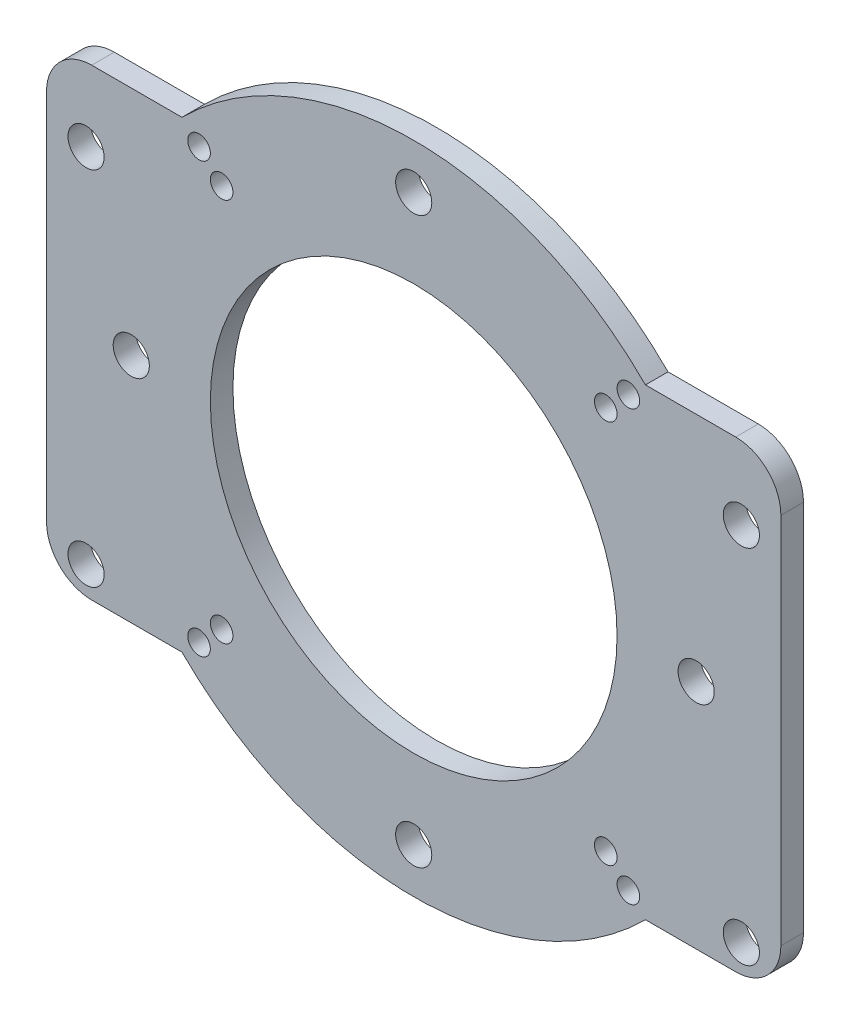
ISO-10303-21;
HEADER;
FILE_DESCRIPTION(('STEP AP214'),'2;1');
FILE_NAME('part.step','',(''),(''),'','','');
FILE_SCHEMA(('AUTOMOTIVE_DESIGN { 1 0 10303 214 1 1 1 1 }'));
ENDSEC;
DATA;
#1=APPLICATION_CONTEXT('core data for automotive mechanical design processes');
#2=APPLICATION_PROTOCOL_DEFINITION('international standard','automotive_design',2000,#1);
#3=PRODUCT_CONTEXT('',#1,'mechanical');
#4=PRODUCT('Part','Part','',(#3));
#5=PRODUCT_RELATED_PRODUCT_CATEGORY('part','',(#4));
#6=PRODUCT_DEFINITION_FORMATION('','',#4);
#7=PRODUCT_DEFINITION_CONTEXT('part definition',#1,'design');
#8=PRODUCT_DEFINITION('design','',#6,#7);
#9=PRODUCT_DEFINITION_SHAPE('','',#8);
#10=(LENGTH_UNIT() NAMED_UNIT(*) SI_UNIT(.MILLI.,.METRE.));
#11=(NAMED_UNIT(*) PLANE_ANGLE_UNIT() SI_UNIT($,.RADIAN.));
#12=(NAMED_UNIT(*) SI_UNIT($,.STERADIAN.) SOLID_ANGLE_UNIT());
#13=UNCERTAINTY_MEASURE_WITH_UNIT(LENGTH_MEASURE(1.E-05),#10,'distance_accuracy_value','');
#14=(GEOMETRIC_REPRESENTATION_CONTEXT(3) GLOBAL_UNCERTAINTY_ASSIGNED_CONTEXT((#13)) GLOBAL_UNIT_ASSIGNED_CONTEXT((#10,
#11,#12)) REPRESENTATION_CONTEXT('',''));
#15=CARTESIAN_POINT('',(0.,0.,0.));
#16=DIRECTION('',(0.,0.,1.));
#17=DIRECTION('',(1.,0.,0.));
#18=AXIS2_PLACEMENT_3D('',#15,#16,#17);
#19=CARTESIAN_POINT('',(0.,0.,2.));
#20=DIRECTION('',(0.,0.,1.));
#21=DIRECTION('',(1.,0.,0.));
#22=AXIS2_PLACEMENT_3D('',#19,#20,#21);
#23=PLANE('',#22);
#24=CARTESIAN_POINT('',(0.,25.,2.));
#25=DIRECTION('',(0.,0.,1.));
#26=DIRECTION('',(1.,0.,0.));
#27=AXIS2_PLACEMENT_3D('',#24,#25,#26);
#28=CIRCLE('',#27,1.6);
#29=CARTESIAN_POINT('',(1.6,25.,2.));
#30=VERTEX_POINT('',#29);
#31=EDGE_CURVE('E621',#30,#30,#28,.T.);
#32=ORIENTED_EDGE('',*,*,#31,.F.);
#33=EDGE_LOOP('',(#32));
#34=FACE_BOUND('',#33,.T.);
#35=CARTESIAN_POINT('',(-25.,0.,2.));
#36=DIRECTION('',(0.,0.,1.));
#37=DIRECTION('',(1.,0.,0.));
#38=AXIS2_PLACEMENT_3D('',#35,#36,#37);
#39=CIRCLE('',#38,1.6);
#40=CARTESIAN_POINT('',(-23.4,0.,2.));
#41=VERTEX_POINT('',#40);
#42=EDGE_CURVE('E637',#41,#41,#39,.T.);
#43=ORIENTED_EDGE('',*,*,#42,.F.);
#44=EDGE_LOOP('',(#43));
#45=FACE_BOUND('',#44,.T.);
#46=CARTESIAN_POINT('',(25.,0.,2.));
#47=DIRECTION('',(0.,0.,1.));
#48=DIRECTION('',(1.,0.,0.));
#49=AXIS2_PLACEMENT_3D('',#46,#47,#48);
#50=CIRCLE('',#49,1.6);
#51=CARTESIAN_POINT('',(26.6,0.,2.));
#52=VERTEX_POINT('',#51);
#53=EDGE_CURVE('E631',#52,#52,#50,.T.);
#54=ORIENTED_EDGE('',*,*,#53,.F.);
#55=EDGE_LOOP('',(#54));
#56=FACE_BOUND('',#55,.T.);
#57=CARTESIAN_POINT('',(0.,-25.,2.));
#58=DIRECTION('',(0.,0.,1.));
#59=DIRECTION('',(1.,0.,0.));
#60=AXIS2_PLACEMENT_3D('',#57,#58,#59);
#61=CIRCLE('',#60,1.6);
#62=CARTESIAN_POINT('',(1.6,-25.,2.));
#63=VERTEX_POINT('',#62);
#64=EDGE_CURVE('E625',#63,#63,#61,.T.);
#65=ORIENTED_EDGE('',*,*,#64,.F.);
#66=EDGE_LOOP('',(#65));
#67=FACE_BOUND('',#66,.T.);
#68=CARTESIAN_POINT('',(-19.,19.,2.));
#69=DIRECTION('',(0.,0.,1.));
#70=DIRECTION('',(1.,0.,0.));
#71=AXIS2_PLACEMENT_3D('',#68,#69,#70);
#72=CIRCLE('',#71,0.999999999999987);
#73=CARTESIAN_POINT('',(-18.,19.,2.));
#74=VERTEX_POINT('',#73);
#75=EDGE_CURVE('E618',#74,#74,#72,.T.);
#76=ORIENTED_EDGE('',*,*,#75,.F.);
#77=EDGE_LOOP('',(#76));
#78=FACE_BOUND('',#77,.T.);
#79=CARTESIAN_POINT('',(-17.,17.,2.));
#80=DIRECTION('',(0.,0.,1.));
#81=DIRECTION('',(1.,0.,0.));
#82=AXIS2_PLACEMENT_3D('',#79,#80,#81);
#83=CIRCLE('',#82,0.999999999999987);
#84=CARTESIAN_POINT('',(-16.,17.,2.));
#85=VERTEX_POINT('',#84);
#86=EDGE_CURVE('E612',#85,#85,#83,.T.);
#87=ORIENTED_EDGE('',*,*,#86,.F.);
#88=EDGE_LOOP('',(#87));
#89=FACE_BOUND('',#88,.T.);
#90=CARTESIAN_POINT('',(17.,17.,2.));
#91=DIRECTION('',(0.,0.,1.));
#92=DIRECTION('',(1.,0.,0.));
#93=AXIS2_PLACEMENT_3D('',#90,#91,#92);
#94=CIRCLE('',#93,0.999999999999987);
#95=CARTESIAN_POINT('',(18.,17.,2.));
#96=VERTEX_POINT('',#95);
#97=EDGE_CURVE('E606',#96,#96,#94,.T.);
#98=ORIENTED_EDGE('',*,*,#97,.F.);
#99=EDGE_LOOP('',(#98));
#100=FACE_BOUND('',#99,.T.);
#101=CARTESIAN_POINT('',(19.,19.,2.));
#102=DIRECTION('',(0.,0.,1.));
#103=DIRECTION('',(1.,0.,0.));
#104=AXIS2_PLACEMENT_3D('',#101,#102,#103);
#105=CIRCLE('',#104,0.999999999999987);
#106=CARTESIAN_POINT('',(20.,19.,2.));
#107=VERTEX_POINT('',#106);
#108=EDGE_CURVE('E600',#107,#107,#105,.T.);
#109=ORIENTED_EDGE('',*,*,#108,.F.);
#110=EDGE_LOOP('',(#109));
#111=FACE_BOUND('',#110,.T.);
#112=CARTESIAN_POINT('',(17.,-17.,2.));
#113=DIRECTION('',(0.,0.,1.));
#114=DIRECTION('',(1.,0.,0.));
#115=AXIS2_PLACEMENT_3D('',#112,#113,#114);
#116=CIRCLE('',#115,0.999999999999987);
#117=CARTESIAN_POINT('',(18.,-17.,2.));
#118=VERTEX_POINT('',#117);
#119=EDGE_CURVE('E594',#118,#118,#116,.T.);
#120=ORIENTED_EDGE('',*,*,#119,.F.);
#121=EDGE_LOOP('',(#120));
#122=FACE_BOUND('',#121,.T.);
#123=CARTESIAN_POINT('',(19.,-19.,2.));
#124=DIRECTION('',(0.,0.,1.));
#125=DIRECTION('',(1.,0.,0.));
#126=AXIS2_PLACEMENT_3D('',#123,#124,#125);
#127=CIRCLE('',#126,0.999999999999987);
#128=CARTESIAN_POINT('',(20.,-19.,2.));
#129=VERTEX_POINT('',#128);
#130=EDGE_CURVE('E588',#129,#129,#127,.T.);
#131=ORIENTED_EDGE('',*,*,#130,.F.);
#132=EDGE_LOOP('',(#131));
#133=FACE_BOUND('',#132,.T.);
#134=CARTESIAN_POINT('',(-19.,-19.,2.));
#135=DIRECTION('',(0.,0.,1.));
#136=DIRECTION('',(1.,0.,0.));
#137=AXIS2_PLACEMENT_3D('',#134,#135,#136);
#138=CIRCLE('',#137,0.999999999999987);
#139=CARTESIAN_POINT('',(-18.,-19.,2.));
#140=VERTEX_POINT('',#139);
#141=EDGE_CURVE('E582',#140,#140,#138,.T.);
#142=ORIENTED_EDGE('',*,*,#141,.F.);
#143=EDGE_LOOP('',(#142));
#144=FACE_BOUND('',#143,.T.);
#145=CARTESIAN_POINT('',(-17.,-17.,2.));
#146=DIRECTION('',(0.,0.,1.));
#147=DIRECTION('',(1.,0.,0.));
#148=AXIS2_PLACEMENT_3D('',#145,#146,#147);
#149=CIRCLE('',#148,0.999999999999987);
#150=CARTESIAN_POINT('',(-16.,-17.,2.));
#151=VERTEX_POINT('',#150);
#152=EDGE_CURVE('E576',#151,#151,#149,.T.);
#153=ORIENTED_EDGE('',*,*,#152,.F.);
#154=EDGE_LOOP('',(#153));
#155=FACE_BOUND('',#154,.T.);
#156=CARTESIAN_POINT('',(29.,14.,2.));
#157=DIRECTION('',(0.,0.,1.));
#158=DIRECTION('',(1.,0.,0.));
#159=AXIS2_PLACEMENT_3D('',#156,#157,#158);
#160=CIRCLE('',#159,1.6);
#161=CARTESIAN_POINT('',(30.6,14.,2.));
#162=VERTEX_POINT('',#161);
#163=EDGE_CURVE('E556',#162,#162,#160,.T.);
#164=ORIENTED_EDGE('',*,*,#163,.F.);
#165=EDGE_LOOP('',(#164));
#166=FACE_BOUND('',#165,.T.);
#167=CARTESIAN_POINT('',(29.,-18.,2.));
#168=DIRECTION('',(0.,0.,1.));
#169=DIRECTION('',(1.,0.,0.));
#170=AXIS2_PLACEMENT_3D('',#167,#168,#169);
#171=CIRCLE('',#170,1.6);
#172=CARTESIAN_POINT('',(30.6,-18.,2.));
#173=VERTEX_POINT('',#172);
#174=EDGE_CURVE('E563',#173,#173,#171,.T.);
#175=ORIENTED_EDGE('',*,*,#174,.F.);
#176=EDGE_LOOP('',(#175));
#177=FACE_BOUND('',#176,.T.);
#178=CARTESIAN_POINT('',(-29.,-18.,2.));
#179=DIRECTION('',(0.,0.,1.));
#180=DIRECTION('',(1.,0.,0.));
#181=AXIS2_PLACEMENT_3D('',#178,#179,#180);
#182=CIRCLE('',#181,1.6);
#183=CARTESIAN_POINT('',(-27.4,-18.,2.));
#184=VERTEX_POINT('',#183);
#185=EDGE_CURVE('E569',#184,#184,#182,.T.);
#186=ORIENTED_EDGE('',*,*,#185,.F.);
#187=EDGE_LOOP('',(#186));
#188=FACE_BOUND('',#187,.T.);
#189=CARTESIAN_POINT('',(-29.,14.,2.));
#190=DIRECTION('',(0.,0.,1.));
#191=DIRECTION('',(1.,0.,0.));
#192=AXIS2_PLACEMENT_3D('',#189,#190,#191);
#193=CIRCLE('',#192,1.6);
#194=CARTESIAN_POINT('',(-27.4,14.,2.));
#195=VERTEX_POINT('',#194);
#196=EDGE_CURVE('E549',#195,#195,#193,.T.);
#197=ORIENTED_EDGE('',*,*,#196,.F.);
#198=EDGE_LOOP('',(#197));
#199=FACE_BOUND('',#198,.T.);
#200=DIRECTION('',(0.,-1.,0.));
#201=VECTOR('',#200,1.);
#202=CARTESIAN_POINT('',(-32.5,-20.5,2.));
#203=LINE('',#202,#201);
#204=CARTESIAN_POINT('',(-32.5,16.5,2.));
#205=VERTEX_POINT('',#204);
#206=CARTESIAN_POINT('',(-32.5,-16.5,2.));
#207=VERTEX_POINT('',#206);
#208=EDGE_CURVE('E240',#205,#207,#203,.T.);
#209=ORIENTED_EDGE('',*,*,#208,.T.);
#210=CARTESIAN_POINT('',(-28.5,-16.5,2.));
#211=DIRECTION('',(0.,0.,1.));
#212=DIRECTION('',(1.,0.,0.));
#213=AXIS2_PLACEMENT_3D('',#210,#211,#212);
#214=CIRCLE('',#213,4.);
#215=CARTESIAN_POINT('',(-28.5,-20.5,2.));
#216=VERTEX_POINT('',#215);
#217=EDGE_CURVE('E179',#207,#216,#214,.T.);
#218=ORIENTED_EDGE('',*,*,#217,.T.);
#219=DIRECTION('',(1.,0.,0.));
#220=VECTOR('',#219,1.);
#221=CARTESIAN_POINT('',(-20.512191496766,-20.5,2.));
#222=LINE('',#221,#220);
#223=CARTESIAN_POINT('',(-20.512191496766,-20.5,2.));
#224=VERTEX_POINT('',#223);
#225=EDGE_CURVE('E142',#216,#224,#222,.T.);
#226=ORIENTED_EDGE('',*,*,#225,.T.);
#227=CARTESIAN_POINT('',(0.,0.,2.));
#228=DIRECTION('',(0.,0.,1.));
#229=DIRECTION('',(1.,0.,0.));
#230=AXIS2_PLACEMENT_3D('',#227,#228,#229);
#231=CIRCLE('',#230,29.);
#232=CARTESIAN_POINT('',(20.512191496766,-20.5,2.));
#233=VERTEX_POINT('',#232);
#234=EDGE_CURVE('E136',#224,#233,#231,.T.);
#235=ORIENTED_EDGE('',*,*,#234,.T.);
#236=DIRECTION('',(1.,0.,0.));
#237=VECTOR('',#236,1.);
#238=CARTESIAN_POINT('',(32.5,-20.5,2.));
#239=LINE('',#238,#237);
#240=CARTESIAN_POINT('',(28.5,-20.5,2.));
#241=VERTEX_POINT('',#240);
#242=EDGE_CURVE('E126',#233,#241,#239,.T.);
#243=ORIENTED_EDGE('',*,*,#242,.T.);
#244=CARTESIAN_POINT('',(28.5,-16.5,2.));
#245=DIRECTION('',(0.,0.,1.));
#246=DIRECTION('',(1.,0.,0.));
#247=AXIS2_PLACEMENT_3D('',#244,#245,#246);
#248=CIRCLE('',#247,4.);
#249=CARTESIAN_POINT('',(32.5,-16.5,2.));
#250=VERTEX_POINT('',#249);
#251=EDGE_CURVE('E174',#241,#250,#248,.T.);
#252=ORIENTED_EDGE('',*,*,#251,.T.);
#253=DIRECTION('',(0.,1.,0.));
#254=VECTOR('',#253,1.);
#255=CARTESIAN_POINT('',(32.5,20.5,2.));
#256=LINE('',#255,#254);
#257=CARTESIAN_POINT('',(32.5,16.5,2.));
#258=VERTEX_POINT('',#257);
#259=EDGE_CURVE('E135',#250,#258,#256,.T.);
#260=ORIENTED_EDGE('',*,*,#259,.T.);
#261=CARTESIAN_POINT('',(28.5,16.5,2.));
#262=DIRECTION('',(0.,0.,1.));
#263=DIRECTION('',(1.,0.,0.));
#264=AXIS2_PLACEMENT_3D('',#261,#262,#263);
#265=CIRCLE('',#264,4.);
#266=CARTESIAN_POINT('',(28.5,20.5,2.));
#267=VERTEX_POINT('',#266);
#268=EDGE_CURVE('E58',#258,#267,#265,.T.);
#269=ORIENTED_EDGE('',*,*,#268,.T.);
#270=DIRECTION('',(-1.,0.,0.));
#271=VECTOR('',#270,1.);
#272=CARTESIAN_POINT('',(20.512191496766,20.5,2.));
#273=LINE('',#272,#271);
#274=CARTESIAN_POINT('',(20.512191496766,20.5,2.));
#275=VERTEX_POINT('',#274);
#276=EDGE_CURVE('E196',#267,#275,#273,.T.);
#277=ORIENTED_EDGE('',*,*,#276,.T.);
#278=CARTESIAN_POINT('',(0.,0.,2.));
#279=DIRECTION('',(0.,0.,1.));
#280=DIRECTION('',(1.,0.,0.));
#281=AXIS2_PLACEMENT_3D('',#278,#279,#280);
#282=CIRCLE('',#281,29.);
#283=CARTESIAN_POINT('',(-20.512191496766,20.5,2.));
#284=VERTEX_POINT('',#283);
#285=EDGE_CURVE('E244',#275,#284,#282,.T.);
#286=ORIENTED_EDGE('',*,*,#285,.T.);
#287=DIRECTION('',(-1.,0.,0.));
#288=VECTOR('',#287,1.);
#289=CARTESIAN_POINT('',(-32.5,20.5,2.));
#290=LINE('',#289,#288);
#291=CARTESIAN_POINT('',(-28.5,20.5,2.));
#292=VERTEX_POINT('',#291);
#293=EDGE_CURVE('E228',#284,#292,#290,.T.);
#294=ORIENTED_EDGE('',*,*,#293,.T.);
#295=CARTESIAN_POINT('',(-28.5,16.5,2.));
#296=DIRECTION('',(0.,0.,1.));
#297=DIRECTION('',(1.,0.,0.));
#298=AXIS2_PLACEMENT_3D('',#295,#296,#297);
#299=CIRCLE('',#298,4.);
#300=EDGE_CURVE('E177',#292,#205,#299,.T.);
#301=ORIENTED_EDGE('',*,*,#300,.T.);
#302=EDGE_LOOP('',(#209,#218,#226,#235,#243,#252,#260,#269,#277,#286,#294,#301));
#303=FACE_BOUND('',#302,.T.);
#304=CARTESIAN_POINT('',(0.,0.,2.));
#305=DIRECTION('',(0.,0.,1.));
#306=DIRECTION('',(1.,0.,0.));
#307=AXIS2_PLACEMENT_3D('',#304,#305,#306);
#308=CIRCLE('',#307,18.);
#309=CARTESIAN_POINT('',(18.,0.,2.));
#310=VERTEX_POINT('',#309);
#311=EDGE_CURVE('E248',#310,#310,#308,.T.);
#312=ORIENTED_EDGE('',*,*,#311,.F.);
#313=EDGE_LOOP('',(#312));
#314=FACE_BOUND('',#313,.T.);
#315=ADVANCED_FACE('F35',(#34,#45,#56,#67,#78,#89,#100,#111,#122,#133,#144,#155,#166,#177,#188,
#199,#303,#314),#23,.T.);
#316=CARTESIAN_POINT('',(0.,0.,0.));
#317=DIRECTION('',(0.,0.,1.));
#318=DIRECTION('',(1.,0.,0.));
#319=AXIS2_PLACEMENT_3D('',#316,#317,#318);
#320=PLANE('',#319);
#321=CARTESIAN_POINT('',(0.,25.,0.));
#322=DIRECTION('',(0.,0.,1.));
#323=DIRECTION('',(1.,0.,0.));
#324=AXIS2_PLACEMENT_3D('',#321,#322,#323);
#325=CIRCLE('',#324,1.6);
#326=CARTESIAN_POINT('',(1.6,25.,0.));
#327=VERTEX_POINT('',#326);
#328=EDGE_CURVE('E640',#327,#327,#325,.T.);
#329=ORIENTED_EDGE('',*,*,#328,.T.);
#330=EDGE_LOOP('',(#329));
#331=FACE_BOUND('',#330,.T.);
#332=CARTESIAN_POINT('',(-25.,0.,0.));
#333=DIRECTION('',(0.,0.,1.));
#334=DIRECTION('',(1.,0.,0.));
#335=AXIS2_PLACEMENT_3D('',#332,#333,#334);
#336=CIRCLE('',#335,1.6);
#337=CARTESIAN_POINT('',(-23.4,0.,0.));
#338=VERTEX_POINT('',#337);
#339=EDGE_CURVE('E634',#338,#338,#336,.T.);
#340=ORIENTED_EDGE('',*,*,#339,.T.);
#341=EDGE_LOOP('',(#340));
#342=FACE_BOUND('',#341,.T.);
#343=CARTESIAN_POINT('',(25.,0.,0.));
#344=DIRECTION('',(0.,0.,1.));
#345=DIRECTION('',(1.,0.,0.));
#346=AXIS2_PLACEMENT_3D('',#343,#344,#345);
#347=CIRCLE('',#346,1.6);
#348=CARTESIAN_POINT('',(26.6,0.,0.));
#349=VERTEX_POINT('',#348);
#350=EDGE_CURVE('E628',#349,#349,#347,.T.);
#351=ORIENTED_EDGE('',*,*,#350,.T.);
#352=EDGE_LOOP('',(#351));
#353=FACE_BOUND('',#352,.T.);
#354=CARTESIAN_POINT('',(0.,-25.,0.));
#355=DIRECTION('',(0.,0.,1.));
#356=DIRECTION('',(1.,0.,0.));
#357=AXIS2_PLACEMENT_3D('',#354,#355,#356);
#358=CIRCLE('',#357,1.6);
#359=CARTESIAN_POINT('',(1.6,-25.,0.));
#360=VERTEX_POINT('',#359);
#361=EDGE_CURVE('E622',#360,#360,#358,.T.);
#362=ORIENTED_EDGE('',*,*,#361,.T.);
#363=EDGE_LOOP('',(#362));
#364=FACE_BOUND('',#363,.T.);
#365=CARTESIAN_POINT('',(-19.,19.,0.));
#366=DIRECTION('',(0.,0.,1.));
#367=DIRECTION('',(1.,0.,0.));
#368=AXIS2_PLACEMENT_3D('',#365,#366,#367);
#369=CIRCLE('',#368,1.);
#370=CARTESIAN_POINT('',(-18.,19.,0.));
#371=VERTEX_POINT('',#370);
#372=EDGE_CURVE('E615',#371,#371,#369,.T.);
#373=ORIENTED_EDGE('',*,*,#372,.T.);
#374=EDGE_LOOP('',(#373));
#375=FACE_BOUND('',#374,.T.);
#376=CARTESIAN_POINT('',(-17.,17.,0.));
#377=DIRECTION('',(0.,0.,1.));
#378=DIRECTION('',(1.,0.,0.));
#379=AXIS2_PLACEMENT_3D('',#376,#377,#378);
#380=CIRCLE('',#379,1.);
#381=CARTESIAN_POINT('',(-16.,17.,0.));
#382=VERTEX_POINT('',#381);
#383=EDGE_CURVE('E609',#382,#382,#380,.T.);
#384=ORIENTED_EDGE('',*,*,#383,.T.);
#385=EDGE_LOOP('',(#384));
#386=FACE_BOUND('',#385,.T.);
#387=CARTESIAN_POINT('',(17.,17.,0.));
#388=DIRECTION('',(0.,0.,1.));
#389=DIRECTION('',(1.,0.,0.));
#390=AXIS2_PLACEMENT_3D('',#387,#388,#389);
#391=CIRCLE('',#390,1.);
#392=CARTESIAN_POINT('',(18.,17.,0.));
#393=VERTEX_POINT('',#392);
#394=EDGE_CURVE('E603',#393,#393,#391,.T.);
#395=ORIENTED_EDGE('',*,*,#394,.T.);
#396=EDGE_LOOP('',(#395));
#397=FACE_BOUND('',#396,.T.);
#398=CARTESIAN_POINT('',(19.,19.,0.));
#399=DIRECTION('',(0.,0.,1.));
#400=DIRECTION('',(1.,0.,0.));
#401=AXIS2_PLACEMENT_3D('',#398,#399,#400);
#402=CIRCLE('',#401,1.);
#403=CARTESIAN_POINT('',(20.,19.,0.));
#404=VERTEX_POINT('',#403);
#405=EDGE_CURVE('E597',#404,#404,#402,.T.);
#406=ORIENTED_EDGE('',*,*,#405,.T.);
#407=EDGE_LOOP('',(#406));
#408=FACE_BOUND('',#407,.T.);
#409=CARTESIAN_POINT('',(17.,-17.,0.));
#410=DIRECTION('',(0.,0.,1.));
#411=DIRECTION('',(1.,0.,0.));
#412=AXIS2_PLACEMENT_3D('',#409,#410,#411);
#413=CIRCLE('',#412,1.);
#414=CARTESIAN_POINT('',(18.,-17.,0.));
#415=VERTEX_POINT('',#414);
#416=EDGE_CURVE('E591',#415,#415,#413,.T.);
#417=ORIENTED_EDGE('',*,*,#416,.T.);
#418=EDGE_LOOP('',(#417));
#419=FACE_BOUND('',#418,.T.);
#420=CARTESIAN_POINT('',(19.,-19.,0.));
#421=DIRECTION('',(0.,0.,1.));
#422=DIRECTION('',(1.,0.,0.));
#423=AXIS2_PLACEMENT_3D('',#420,#421,#422);
#424=CIRCLE('',#423,1.);
#425=CARTESIAN_POINT('',(20.,-19.,0.));
#426=VERTEX_POINT('',#425);
#427=EDGE_CURVE('E585',#426,#426,#424,.T.);
#428=ORIENTED_EDGE('',*,*,#427,.T.);
#429=EDGE_LOOP('',(#428));
#430=FACE_BOUND('',#429,.T.);
#431=CARTESIAN_POINT('',(-19.,-19.,0.));
#432=DIRECTION('',(0.,0.,1.));
#433=DIRECTION('',(1.,0.,0.));
#434=AXIS2_PLACEMENT_3D('',#431,#432,#433);
#435=CIRCLE('',#434,1.);
#436=CARTESIAN_POINT('',(-18.,-19.,0.));
#437=VERTEX_POINT('',#436);
#438=EDGE_CURVE('E579',#437,#437,#435,.T.);
#439=ORIENTED_EDGE('',*,*,#438,.T.);
#440=EDGE_LOOP('',(#439));
#441=FACE_BOUND('',#440,.T.);
#442=CARTESIAN_POINT('',(-17.,-17.,0.));
#443=DIRECTION('',(0.,0.,1.));
#444=DIRECTION('',(1.,0.,0.));
#445=AXIS2_PLACEMENT_3D('',#442,#443,#444);
#446=CIRCLE('',#445,1.);
#447=CARTESIAN_POINT('',(-16.,-17.,0.));
#448=VERTEX_POINT('',#447);
#449=EDGE_CURVE('E560',#448,#448,#446,.T.);
#450=ORIENTED_EDGE('',*,*,#449,.T.);
#451=EDGE_LOOP('',(#450));
#452=FACE_BOUND('',#451,.T.);
#453=CARTESIAN_POINT('',(29.,14.,0.));
#454=DIRECTION('',(0.,0.,1.));
#455=DIRECTION('',(1.,0.,0.));
#456=AXIS2_PLACEMENT_3D('',#453,#454,#455);
#457=CIRCLE('',#456,1.6);
#458=CARTESIAN_POINT('',(30.6,14.,0.));
#459=VERTEX_POINT('',#458);
#460=EDGE_CURVE('E559',#459,#459,#457,.T.);
#461=ORIENTED_EDGE('',*,*,#460,.T.);
#462=EDGE_LOOP('',(#461));
#463=FACE_BOUND('',#462,.T.);
#464=CARTESIAN_POINT('',(29.,-18.,0.));
#465=DIRECTION('',(0.,0.,1.));
#466=DIRECTION('',(1.,0.,0.));
#467=AXIS2_PLACEMENT_3D('',#464,#465,#466);
#468=CIRCLE('',#467,1.6);
#469=CARTESIAN_POINT('',(30.6,-18.,0.));
#470=VERTEX_POINT('',#469);
#471=EDGE_CURVE('E566',#470,#470,#468,.T.);
#472=ORIENTED_EDGE('',*,*,#471,.T.);
#473=EDGE_LOOP('',(#472));
#474=FACE_BOUND('',#473,.T.);
#475=CARTESIAN_POINT('',(-29.,-18.,0.));
#476=DIRECTION('',(0.,0.,1.));
#477=DIRECTION('',(1.,0.,0.));
#478=AXIS2_PLACEMENT_3D('',#475,#476,#477);
#479=CIRCLE('',#478,1.6);
#480=CARTESIAN_POINT('',(-27.4,-18.,0.));
#481=VERTEX_POINT('',#480);
#482=EDGE_CURVE('E554',#481,#481,#479,.T.);
#483=ORIENTED_EDGE('',*,*,#482,.T.);
#484=EDGE_LOOP('',(#483));
#485=FACE_BOUND('',#484,.T.);
#486=CARTESIAN_POINT('',(-29.,14.,0.));
#487=DIRECTION('',(0.,0.,1.));
#488=DIRECTION('',(1.,0.,0.));
#489=AXIS2_PLACEMENT_3D('',#486,#487,#488);
#490=CIRCLE('',#489,1.6);
#491=CARTESIAN_POINT('',(-27.4,14.,0.));
#492=VERTEX_POINT('',#491);
#493=EDGE_CURVE('E545',#492,#492,#490,.T.);
#494=ORIENTED_EDGE('',*,*,#493,.T.);
#495=EDGE_LOOP('',(#494));
#496=FACE_BOUND('',#495,.T.);
#497=DIRECTION('',(1.,0.,0.));
#498=VECTOR('',#497,1.);
#499=CARTESIAN_POINT('',(-20.512191496766,-20.5,0.));
#500=LINE('',#499,#498);
#501=CARTESIAN_POINT('',(-28.5,-20.5,0.));
#502=VERTEX_POINT('',#501);
#503=CARTESIAN_POINT('',(-20.512191496766,-20.5,0.));
#504=VERTEX_POINT('',#503);
#505=EDGE_CURVE('E146',#502,#504,#500,.T.);
#506=ORIENTED_EDGE('',*,*,#505,.F.);
#507=CARTESIAN_POINT('',(-28.5,-16.5,0.));
#508=DIRECTION('',(0.,0.,1.));
#509=DIRECTION('',(1.,0.,0.));
#510=AXIS2_PLACEMENT_3D('',#507,#508,#509);
#511=CIRCLE('',#510,4.);
#512=CARTESIAN_POINT('',(-32.5,-16.5,0.));
#513=VERTEX_POINT('',#512);
#514=EDGE_CURVE('E167',#502,#513,#511,.F.);
#515=ORIENTED_EDGE('',*,*,#514,.T.);
#516=DIRECTION('',(0.,-1.,0.));
#517=VECTOR('',#516,1.);
#518=CARTESIAN_POINT('',(-32.5,-20.5,0.));
#519=LINE('',#518,#517);
#520=CARTESIAN_POINT('',(-32.5,16.5,0.));
#521=VERTEX_POINT('',#520);
#522=EDGE_CURVE('E220',#521,#513,#519,.T.);
#523=ORIENTED_EDGE('',*,*,#522,.F.);
#524=CARTESIAN_POINT('',(-28.5,16.5,0.));
#525=DIRECTION('',(0.,0.,1.));
#526=DIRECTION('',(1.,0.,0.));
#527=AXIS2_PLACEMENT_3D('',#524,#525,#526);
#528=CIRCLE('',#527,4.);
#529=CARTESIAN_POINT('',(-28.5,20.5,0.));
#530=VERTEX_POINT('',#529);
#531=EDGE_CURVE('E165',#521,#530,#528,.F.);
#532=ORIENTED_EDGE('',*,*,#531,.T.);
#533=DIRECTION('',(-1.,0.,0.));
#534=VECTOR('',#533,1.);
#535=CARTESIAN_POINT('',(-32.5,20.5,0.));
#536=LINE('',#535,#534);
#537=CARTESIAN_POINT('',(-20.512191496766,20.5,0.));
#538=VERTEX_POINT('',#537);
#539=EDGE_CURVE('E213',#538,#530,#536,.T.);
#540=ORIENTED_EDGE('',*,*,#539,.F.);
#541=CARTESIAN_POINT('',(0.,0.,0.));
#542=DIRECTION('',(0.,0.,1.));
#543=DIRECTION('',(1.,0.,0.));
#544=AXIS2_PLACEMENT_3D('',#541,#542,#543);
#545=CIRCLE('',#544,29.);
#546=CARTESIAN_POINT('',(20.512191496766,20.5,0.));
#547=VERTEX_POINT('',#546);
#548=EDGE_CURVE('E211',#547,#538,#545,.T.);
#549=ORIENTED_EDGE('',*,*,#548,.F.);
#550=DIRECTION('',(-1.,0.,0.));
#551=VECTOR('',#550,1.);
#552=CARTESIAN_POINT('',(20.512191496766,20.5,0.));
#553=LINE('',#552,#551);
#554=CARTESIAN_POINT('',(28.5,20.5,0.));
#555=VERTEX_POINT('',#554);
#556=EDGE_CURVE('E204',#555,#547,#553,.T.);
#557=ORIENTED_EDGE('',*,*,#556,.F.);
#558=CARTESIAN_POINT('',(28.5,16.5,0.));
#559=DIRECTION('',(0.,0.,1.));
#560=DIRECTION('',(1.,0.,0.));
#561=AXIS2_PLACEMENT_3D('',#558,#559,#560);
#562=CIRCLE('',#561,4.);
#563=CARTESIAN_POINT('',(32.5,16.5,0.));
#564=VERTEX_POINT('',#563);
#565=EDGE_CURVE('E163',#555,#564,#562,.F.);
#566=ORIENTED_EDGE('',*,*,#565,.T.);
#567=DIRECTION('',(0.,1.,0.));
#568=VECTOR('',#567,1.);
#569=CARTESIAN_POINT('',(32.5,20.5,0.));
#570=LINE('',#569,#568);
#571=CARTESIAN_POINT('',(32.5,-16.5,0.));
#572=VERTEX_POINT('',#571);
#573=EDGE_CURVE('E194',#572,#564,#570,.T.);
#574=ORIENTED_EDGE('',*,*,#573,.F.);
#575=CARTESIAN_POINT('',(28.5,-16.5,0.));
#576=DIRECTION('',(0.,0.,1.));
#577=DIRECTION('',(1.,0.,0.));
#578=AXIS2_PLACEMENT_3D('',#575,#576,#577);
#579=CIRCLE('',#578,4.);
#580=CARTESIAN_POINT('',(28.5,-20.5,0.));
#581=VERTEX_POINT('',#580);
#582=EDGE_CURVE('E155',#572,#581,#579,.F.);
#583=ORIENTED_EDGE('',*,*,#582,.T.);
#584=DIRECTION('',(1.,0.,0.));
#585=VECTOR('',#584,1.);
#586=CARTESIAN_POINT('',(32.5,-20.5,0.));
#587=LINE('',#586,#585);
#588=CARTESIAN_POINT('',(20.512191496766,-20.5,0.));
#589=VERTEX_POINT('',#588);
#590=EDGE_CURVE('E215',#589,#581,#587,.T.);
#591=ORIENTED_EDGE('',*,*,#590,.F.);
#592=CARTESIAN_POINT('',(0.,0.,0.));
#593=DIRECTION('',(0.,0.,1.));
#594=DIRECTION('',(1.,0.,0.));
#595=AXIS2_PLACEMENT_3D('',#592,#593,#594);
#596=CIRCLE('',#595,29.);
#597=EDGE_CURVE('E150',#504,#589,#596,.T.);
#598=ORIENTED_EDGE('',*,*,#597,.F.);
#599=EDGE_LOOP('',(#506,#515,#523,#532,#540,#549,#557,#566,#574,#583,#591,#598));
#600=FACE_BOUND('',#599,.T.);
#601=CARTESIAN_POINT('',(0.,0.,0.));
#602=DIRECTION('',(0.,0.,1.));
#603=DIRECTION('',(1.,0.,0.));
#604=AXIS2_PLACEMENT_3D('',#601,#602,#603);
#605=CIRCLE('',#604,18.);
#606=CARTESIAN_POINT('',(18.,0.,0.));
#607=VERTEX_POINT('',#606);
#608=EDGE_CURVE('E544',#607,#607,#605,.T.);
#609=ORIENTED_EDGE('',*,*,#608,.T.);
#610=EDGE_LOOP('',(#609));
#611=FACE_BOUND('',#610,.T.);
#612=ADVANCED_FACE('F208',(#331,#342,#353,#364,#375,#386,#397,#408,#419,#430,#441,#452,#463,
#474,#485,#496,#600,#611),#320,.F.);
#613=CARTESIAN_POINT('',(0.,0.,2.));
#614=DIRECTION('',(0.,0.,-1.));
#615=DIRECTION('',(-1.,0.,0.));
#616=AXIS2_PLACEMENT_3D('',#613,#614,#615);
#617=CYLINDRICAL_SURFACE('',#616,29.);
#618=ORIENTED_EDGE('',*,*,#597,.T.);
#619=DIRECTION('',(0.,0.,-1.));
#620=VECTOR('',#619,1.);
#621=CARTESIAN_POINT('',(20.512191496766,-20.5,2.));
#622=LINE('',#621,#620);
#623=EDGE_CURVE('E131',#233,#589,#622,.T.);
#624=ORIENTED_EDGE('',*,*,#623,.F.);
#625=ORIENTED_EDGE('',*,*,#234,.F.);
#626=DIRECTION('',(0.,0.,-1.));
#627=VECTOR('',#626,1.);
#628=CARTESIAN_POINT('',(-20.512191496766,-20.5,2.));
#629=LINE('',#628,#627);
#630=EDGE_CURVE('E224',#224,#504,#629,.T.);
#631=ORIENTED_EDGE('',*,*,#630,.T.);
#632=EDGE_LOOP('',(#618,#624,#625,#631));
#633=FACE_BOUND('',#632,.T.);
#634=ADVANCED_FACE('F148',(#633),#617,.T.);
#635=CARTESIAN_POINT('',(32.5,-20.5,2.));
#636=DIRECTION('',(0.,1.,0.));
#637=DIRECTION('',(-1.,0.,0.));
#638=AXIS2_PLACEMENT_3D('',#635,#636,#637);
#639=PLANE('',#638);
#640=ORIENTED_EDGE('',*,*,#590,.T.);
#641=DIRECTION('',(0.,0.,-1.));
#642=VECTOR('',#641,1.);
#643=CARTESIAN_POINT('',(28.5,-20.5,2.));
#644=LINE('',#643,#642);
#645=EDGE_CURVE('E11',#581,#241,#644,.F.);
#646=ORIENTED_EDGE('',*,*,#645,.T.);
#647=ORIENTED_EDGE('',*,*,#242,.F.);
#648=ORIENTED_EDGE('',*,*,#623,.T.);
#649=EDGE_LOOP('',(#640,#646,#647,#648));
#650=FACE_BOUND('',#649,.T.);
#651=ADVANCED_FACE('F129',(#650),#639,.F.);
#652=CARTESIAN_POINT('',(32.5,20.5,2.));
#653=DIRECTION('',(-1.,0.,0.));
#654=DIRECTION('',(0.,-1.,0.));
#655=AXIS2_PLACEMENT_3D('',#652,#653,#654);
#656=PLANE('',#655);
#657=ORIENTED_EDGE('',*,*,#573,.T.);
#658=DIRECTION('',(0.,0.,-1.));
#659=VECTOR('',#658,1.);
#660=CARTESIAN_POINT('',(32.5,16.5,2.));
#661=LINE('',#660,#659);
#662=EDGE_CURVE('E43',#564,#258,#661,.F.);
#663=ORIENTED_EDGE('',*,*,#662,.T.);
#664=ORIENTED_EDGE('',*,*,#259,.F.);
#665=DIRECTION('',(0.,0.,-1.));
#666=VECTOR('',#665,1.);
#667=CARTESIAN_POINT('',(32.5,-16.5,2.));
#668=LINE('',#667,#666);
#669=EDGE_CURVE('E185',#250,#572,#668,.T.);
#670=ORIENTED_EDGE('',*,*,#669,.T.);
#671=EDGE_LOOP('',(#657,#663,#664,#670));
#672=FACE_BOUND('',#671,.T.);
#673=ADVANCED_FACE('F191',(#672),#656,.F.);
#674=CARTESIAN_POINT('',(20.512191496766,20.5,2.));
#675=DIRECTION('',(0.,-1.,0.));
#676=DIRECTION('',(1.,0.,0.));
#677=AXIS2_PLACEMENT_3D('',#674,#675,#676);
#678=PLANE('',#677);
#679=ORIENTED_EDGE('',*,*,#276,.F.);
#680=DIRECTION('',(0.,0.,-1.));
#681=VECTOR('',#680,1.);
#682=CARTESIAN_POINT('',(28.5,20.5,2.));
#683=LINE('',#682,#681);
#684=EDGE_CURVE('E182',#267,#555,#683,.T.);
#685=ORIENTED_EDGE('',*,*,#684,.T.);
#686=ORIENTED_EDGE('',*,*,#556,.T.);
#687=DIRECTION('',(0.,0.,-1.));
#688=VECTOR('',#687,1.);
#689=CARTESIAN_POINT('',(20.512191496766,20.5,2.));
#690=LINE('',#689,#688);
#691=EDGE_CURVE('E152',#275,#547,#690,.T.);
#692=ORIENTED_EDGE('',*,*,#691,.F.);
#693=EDGE_LOOP('',(#679,#685,#686,#692));
#694=FACE_BOUND('',#693,.T.);
#695=ADVANCED_FACE('F202',(#694),#678,.F.);
#696=CARTESIAN_POINT('',(0.,0.,2.));
#697=DIRECTION('',(0.,0.,-1.));
#698=DIRECTION('',(-1.,0.,0.));
#699=AXIS2_PLACEMENT_3D('',#696,#697,#698);
#700=CYLINDRICAL_SURFACE('',#699,29.);
#701=ORIENTED_EDGE('',*,*,#548,.T.);
#702=DIRECTION('',(0.,0.,-1.));
#703=VECTOR('',#702,1.);
#704=CARTESIAN_POINT('',(-20.512191496766,20.5,2.));
#705=LINE('',#704,#703);
#706=EDGE_CURVE('E158',#284,#538,#705,.T.);
#707=ORIENTED_EDGE('',*,*,#706,.F.);
#708=ORIENTED_EDGE('',*,*,#285,.F.);
#709=ORIENTED_EDGE('',*,*,#691,.T.);
#710=EDGE_LOOP('',(#701,#707,#708,#709));
#711=FACE_BOUND('',#710,.T.);
#712=ADVANCED_FACE('F276',(#711),#700,.T.);
#713=CARTESIAN_POINT('',(-32.5,20.5,2.));
#714=DIRECTION('',(0.,-1.,0.));
#715=DIRECTION('',(1.,0.,0.));
#716=AXIS2_PLACEMENT_3D('',#713,#714,#715);
#717=PLANE('',#716);
#718=ORIENTED_EDGE('',*,*,#539,.T.);
#719=DIRECTION('',(0.,0.,-1.));
#720=VECTOR('',#719,1.);
#721=CARTESIAN_POINT('',(-28.5,20.5,2.));
#722=LINE('',#721,#720);
#723=EDGE_CURVE('E50',#530,#292,#722,.F.);
#724=ORIENTED_EDGE('',*,*,#723,.T.);
#725=ORIENTED_EDGE('',*,*,#293,.F.);
#726=ORIENTED_EDGE('',*,*,#706,.T.);
#727=EDGE_LOOP('',(#718,#724,#725,#726));
#728=FACE_BOUND('',#727,.T.);
#729=ADVANCED_FACE('F227',(#728),#717,.F.);
#730=CARTESIAN_POINT('',(-32.5,-20.5,2.));
#731=DIRECTION('',(1.,0.,0.));
#732=DIRECTION('',(0.,1.,0.));
#733=AXIS2_PLACEMENT_3D('',#730,#731,#732);
#734=PLANE('',#733);
#735=ORIENTED_EDGE('',*,*,#522,.T.);
#736=DIRECTION('',(0.,0.,-1.));
#737=VECTOR('',#736,1.);
#738=CARTESIAN_POINT('',(-32.5,-16.5,2.));
#739=LINE('',#738,#737);
#740=EDGE_CURVE('E172',#513,#207,#739,.F.);
#741=ORIENTED_EDGE('',*,*,#740,.T.);
#742=ORIENTED_EDGE('',*,*,#208,.F.);
#743=DIRECTION('',(0.,0.,-1.));
#744=VECTOR('',#743,1.);
#745=CARTESIAN_POINT('',(-32.5,16.5,2.));
#746=LINE('',#745,#744);
#747=EDGE_CURVE('E169',#205,#521,#746,.T.);
#748=ORIENTED_EDGE('',*,*,#747,.T.);
#749=EDGE_LOOP('',(#735,#741,#742,#748));
#750=FACE_BOUND('',#749,.T.);
#751=ADVANCED_FACE('F238',(#750),#734,.F.);
#752=CARTESIAN_POINT('',(-20.512191496766,-20.5,2.));
#753=DIRECTION('',(0.,1.,0.));
#754=DIRECTION('',(-1.,0.,0.));
#755=AXIS2_PLACEMENT_3D('',#752,#753,#754);
#756=PLANE('',#755);
#757=ORIENTED_EDGE('',*,*,#225,.F.);
#758=DIRECTION('',(0.,0.,-1.));
#759=VECTOR('',#758,1.);
#760=CARTESIAN_POINT('',(-28.5,-20.5,2.));
#761=LINE('',#760,#759);
#762=EDGE_CURVE('E151',#216,#502,#761,.T.);
#763=ORIENTED_EDGE('',*,*,#762,.T.);
#764=ORIENTED_EDGE('',*,*,#505,.T.);
#765=ORIENTED_EDGE('',*,*,#630,.F.);
#766=EDGE_LOOP('',(#757,#763,#764,#765));
#767=FACE_BOUND('',#766,.T.);
#768=ADVANCED_FACE('F268',(#767),#756,.F.);
#769=CARTESIAN_POINT('',(0.,0.,2.));
#770=DIRECTION('',(0.,0.,-1.));
#771=DIRECTION('',(-1.,0.,0.));
#772=AXIS2_PLACEMENT_3D('',#769,#770,#771);
#773=CYLINDRICAL_SURFACE('',#772,18.);
#774=ORIENTED_EDGE('',*,*,#311,.T.);
#775=EDGE_LOOP('',(#774));
#776=FACE_BOUND('',#775,.T.);
#777=ORIENTED_EDGE('',*,*,#608,.F.);
#778=EDGE_LOOP('',(#777));
#779=FACE_BOUND('',#778,.T.);
#780=ADVANCED_FACE('F265',(#776,#779),#773,.F.);
#781=CARTESIAN_POINT('',(-29.,14.,0.));
#782=DIRECTION('',(0.,0.,1.));
#783=DIRECTION('',(1.,0.,0.));
#784=AXIS2_PLACEMENT_3D('',#781,#782,#783);
#785=CYLINDRICAL_SURFACE('',#784,1.6);
#786=ORIENTED_EDGE('',*,*,#493,.F.);
#787=EDGE_LOOP('',(#786));
#788=FACE_BOUND('',#787,.T.);
#789=ORIENTED_EDGE('',*,*,#196,.T.);
#790=EDGE_LOOP('',(#789));
#791=FACE_BOUND('',#790,.T.);
#792=ADVANCED_FACE('F448',(#788,#791),#785,.F.);
#793=CARTESIAN_POINT('',(-29.,-18.,0.));
#794=DIRECTION('',(0.,0.,1.));
#795=DIRECTION('',(1.,0.,0.));
#796=AXIS2_PLACEMENT_3D('',#793,#794,#795);
#797=CYLINDRICAL_SURFACE('',#796,1.6);
#798=ORIENTED_EDGE('',*,*,#482,.F.);
#799=EDGE_LOOP('',(#798));
#800=FACE_BOUND('',#799,.T.);
#801=ORIENTED_EDGE('',*,*,#185,.T.);
#802=EDGE_LOOP('',(#801));
#803=FACE_BOUND('',#802,.T.);
#804=ADVANCED_FACE('F439',(#800,#803),#797,.F.);
#805=CARTESIAN_POINT('',(29.,-18.,0.));
#806=DIRECTION('',(0.,0.,1.));
#807=DIRECTION('',(1.,0.,0.));
#808=AXIS2_PLACEMENT_3D('',#805,#806,#807);
#809=CYLINDRICAL_SURFACE('',#808,1.6);
#810=ORIENTED_EDGE('',*,*,#471,.F.);
#811=EDGE_LOOP('',(#810));
#812=FACE_BOUND('',#811,.T.);
#813=ORIENTED_EDGE('',*,*,#174,.T.);
#814=EDGE_LOOP('',(#813));
#815=FACE_BOUND('',#814,.T.);
#816=ADVANCED_FACE('F430',(#812,#815),#809,.F.);
#817=CARTESIAN_POINT('',(29.,14.,0.));
#818=DIRECTION('',(0.,0.,1.));
#819=DIRECTION('',(1.,0.,0.));
#820=AXIS2_PLACEMENT_3D('',#817,#818,#819);
#821=CYLINDRICAL_SURFACE('',#820,1.6);
#822=ORIENTED_EDGE('',*,*,#460,.F.);
#823=EDGE_LOOP('',(#822));
#824=FACE_BOUND('',#823,.T.);
#825=ORIENTED_EDGE('',*,*,#163,.T.);
#826=EDGE_LOOP('',(#825));
#827=FACE_BOUND('',#826,.T.);
#828=ADVANCED_FACE('F421',(#824,#827),#821,.F.);
#829=CARTESIAN_POINT('',(-17.,-17.,2.));
#830=DIRECTION('',(0.,0.,1.));
#831=DIRECTION('',(1.,0.,0.));
#832=AXIS2_PLACEMENT_3D('',#829,#830,#831);
#833=CYLINDRICAL_SURFACE('',#832,0.999999999999994);
#834=ORIENTED_EDGE('',*,*,#449,.F.);
#835=EDGE_LOOP('',(#834));
#836=FACE_BOUND('',#835,.T.);
#837=ORIENTED_EDGE('',*,*,#152,.T.);
#838=EDGE_LOOP('',(#837));
#839=FACE_BOUND('',#838,.T.);
#840=ADVANCED_FACE('F412',(#836,#839),#833,.F.);
#841=CARTESIAN_POINT('',(-19.,-19.,2.));
#842=DIRECTION('',(0.,0.,1.));
#843=DIRECTION('',(1.,0.,0.));
#844=AXIS2_PLACEMENT_3D('',#841,#842,#843);
#845=CYLINDRICAL_SURFACE('',#844,0.999999999999994);
#846=ORIENTED_EDGE('',*,*,#438,.F.);
#847=EDGE_LOOP('',(#846));
#848=FACE_BOUND('',#847,.T.);
#849=ORIENTED_EDGE('',*,*,#141,.T.);
#850=EDGE_LOOP('',(#849));
#851=FACE_BOUND('',#850,.T.);
#852=ADVANCED_FACE('F403',(#848,#851),#845,.F.);
#853=CARTESIAN_POINT('',(19.,-19.,2.));
#854=DIRECTION('',(0.,0.,1.));
#855=DIRECTION('',(1.,0.,0.));
#856=AXIS2_PLACEMENT_3D('',#853,#854,#855);
#857=CYLINDRICAL_SURFACE('',#856,0.999999999999994);
#858=ORIENTED_EDGE('',*,*,#427,.F.);
#859=EDGE_LOOP('',(#858));
#860=FACE_BOUND('',#859,.T.);
#861=ORIENTED_EDGE('',*,*,#130,.T.);
#862=EDGE_LOOP('',(#861));
#863=FACE_BOUND('',#862,.T.);
#864=ADVANCED_FACE('F394',(#860,#863),#857,.F.);
#865=CARTESIAN_POINT('',(17.,-17.,2.));
#866=DIRECTION('',(0.,0.,1.));
#867=DIRECTION('',(1.,0.,0.));
#868=AXIS2_PLACEMENT_3D('',#865,#866,#867);
#869=CYLINDRICAL_SURFACE('',#868,0.999999999999994);
#870=ORIENTED_EDGE('',*,*,#416,.F.);
#871=EDGE_LOOP('',(#870));
#872=FACE_BOUND('',#871,.T.);
#873=ORIENTED_EDGE('',*,*,#119,.T.);
#874=EDGE_LOOP('',(#873));
#875=FACE_BOUND('',#874,.T.);
#876=ADVANCED_FACE('F385',(#872,#875),#869,.F.);
#877=CARTESIAN_POINT('',(19.,19.,2.));
#878=DIRECTION('',(0.,0.,1.));
#879=DIRECTION('',(1.,0.,0.));
#880=AXIS2_PLACEMENT_3D('',#877,#878,#879);
#881=CYLINDRICAL_SURFACE('',#880,0.999999999999994);
#882=ORIENTED_EDGE('',*,*,#405,.F.);
#883=EDGE_LOOP('',(#882));
#884=FACE_BOUND('',#883,.T.);
#885=ORIENTED_EDGE('',*,*,#108,.T.);
#886=EDGE_LOOP('',(#885));
#887=FACE_BOUND('',#886,.T.);
#888=ADVANCED_FACE('F376',(#884,#887),#881,.F.);
#889=CARTESIAN_POINT('',(17.,17.,2.));
#890=DIRECTION('',(0.,0.,1.));
#891=DIRECTION('',(1.,0.,0.));
#892=AXIS2_PLACEMENT_3D('',#889,#890,#891);
#893=CYLINDRICAL_SURFACE('',#892,0.999999999999994);
#894=ORIENTED_EDGE('',*,*,#394,.F.);
#895=EDGE_LOOP('',(#894));
#896=FACE_BOUND('',#895,.T.);
#897=ORIENTED_EDGE('',*,*,#97,.T.);
#898=EDGE_LOOP('',(#897));
#899=FACE_BOUND('',#898,.T.);
#900=ADVANCED_FACE('F367',(#896,#899),#893,.F.);
#901=CARTESIAN_POINT('',(-17.,17.,2.));
#902=DIRECTION('',(0.,0.,1.));
#903=DIRECTION('',(1.,0.,0.));
#904=AXIS2_PLACEMENT_3D('',#901,#902,#903);
#905=CYLINDRICAL_SURFACE('',#904,0.999999999999994);
#906=ORIENTED_EDGE('',*,*,#383,.F.);
#907=EDGE_LOOP('',(#906));
#908=FACE_BOUND('',#907,.T.);
#909=ORIENTED_EDGE('',*,*,#86,.T.);
#910=EDGE_LOOP('',(#909));
#911=FACE_BOUND('',#910,.T.);
#912=ADVANCED_FACE('F358',(#908,#911),#905,.F.);
#913=CARTESIAN_POINT('',(-19.,19.,2.));
#914=DIRECTION('',(0.,0.,1.));
#915=DIRECTION('',(1.,0.,0.));
#916=AXIS2_PLACEMENT_3D('',#913,#914,#915);
#917=CYLINDRICAL_SURFACE('',#916,0.999999999999994);
#918=ORIENTED_EDGE('',*,*,#372,.F.);
#919=EDGE_LOOP('',(#918));
#920=FACE_BOUND('',#919,.T.);
#921=ORIENTED_EDGE('',*,*,#75,.T.);
#922=EDGE_LOOP('',(#921));
#923=FACE_BOUND('',#922,.T.);
#924=ADVANCED_FACE('F349',(#920,#923),#917,.F.);
#925=CARTESIAN_POINT('',(0.,-25.,2.));
#926=DIRECTION('',(0.,0.,-1.));
#927=DIRECTION('',(-1.,0.,0.));
#928=AXIS2_PLACEMENT_3D('',#925,#926,#927);
#929=CYLINDRICAL_SURFACE('',#928,1.6);
#930=ORIENTED_EDGE('',*,*,#64,.T.);
#931=EDGE_LOOP('',(#930));
#932=FACE_BOUND('',#931,.T.);
#933=ORIENTED_EDGE('',*,*,#361,.F.);
#934=EDGE_LOOP('',(#933));
#935=FACE_BOUND('',#934,.T.);
#936=ADVANCED_FACE('F340',(#932,#935),#929,.F.);
#937=CARTESIAN_POINT('',(25.,0.,2.));
#938=DIRECTION('',(0.,0.,-1.));
#939=DIRECTION('',(-1.,0.,0.));
#940=AXIS2_PLACEMENT_3D('',#937,#938,#939);
#941=CYLINDRICAL_SURFACE('',#940,1.6);
#942=ORIENTED_EDGE('',*,*,#53,.T.);
#943=EDGE_LOOP('',(#942));
#944=FACE_BOUND('',#943,.T.);
#945=ORIENTED_EDGE('',*,*,#350,.F.);
#946=EDGE_LOOP('',(#945));
#947=FACE_BOUND('',#946,.T.);
#948=ADVANCED_FACE('F331',(#944,#947),#941,.F.);
#949=CARTESIAN_POINT('',(-25.,0.,2.));
#950=DIRECTION('',(0.,0.,-1.));
#951=DIRECTION('',(-1.,0.,0.));
#952=AXIS2_PLACEMENT_3D('',#949,#950,#951);
#953=CYLINDRICAL_SURFACE('',#952,1.6);
#954=ORIENTED_EDGE('',*,*,#42,.T.);
#955=EDGE_LOOP('',(#954));
#956=FACE_BOUND('',#955,.T.);
#957=ORIENTED_EDGE('',*,*,#339,.F.);
#958=EDGE_LOOP('',(#957));
#959=FACE_BOUND('',#958,.T.);
#960=ADVANCED_FACE('F322',(#956,#959),#953,.F.);
#961=CARTESIAN_POINT('',(0.,25.,2.));
#962=DIRECTION('',(0.,0.,-1.));
#963=DIRECTION('',(-1.,0.,0.));
#964=AXIS2_PLACEMENT_3D('',#961,#962,#963);
#965=CYLINDRICAL_SURFACE('',#964,1.6);
#966=ORIENTED_EDGE('',*,*,#31,.T.);
#967=EDGE_LOOP('',(#966));
#968=FACE_BOUND('',#967,.T.);
#969=ORIENTED_EDGE('',*,*,#328,.F.);
#970=EDGE_LOOP('',(#969));
#971=FACE_BOUND('',#970,.T.);
#972=ADVANCED_FACE('F290',(#968,#971),#965,.F.);
#973=CARTESIAN_POINT('',(-28.5,-16.5,2.));
#974=DIRECTION('',(0.,0.,-1.));
#975=DIRECTION('',(-1.,0.,0.));
#976=AXIS2_PLACEMENT_3D('',#973,#974,#975);
#977=CYLINDRICAL_SURFACE('',#976,4.);
#978=ORIENTED_EDGE('',*,*,#217,.F.);
#979=ORIENTED_EDGE('',*,*,#740,.F.);
#980=ORIENTED_EDGE('',*,*,#514,.F.);
#981=ORIENTED_EDGE('',*,*,#762,.F.);
#982=EDGE_LOOP('',(#978,#979,#980,#981));
#983=FACE_BOUND('',#982,.T.);
#984=ADVANCED_FACE('F287',(#983),#977,.T.);
#985=CARTESIAN_POINT('',(-28.5,16.5,2.));
#986=DIRECTION('',(0.,0.,-1.));
#987=DIRECTION('',(-1.,0.,0.));
#988=AXIS2_PLACEMENT_3D('',#985,#986,#987);
#989=CYLINDRICAL_SURFACE('',#988,4.);
#990=ORIENTED_EDGE('',*,*,#300,.F.);
#991=ORIENTED_EDGE('',*,*,#723,.F.);
#992=ORIENTED_EDGE('',*,*,#531,.F.);
#993=ORIENTED_EDGE('',*,*,#747,.F.);
#994=EDGE_LOOP('',(#990,#991,#992,#993));
#995=FACE_BOUND('',#994,.T.);
#996=ADVANCED_FACE('F235',(#995),#989,.T.);
#997=CARTESIAN_POINT('',(28.5,16.5,2.));
#998=DIRECTION('',(0.,0.,-1.));
#999=DIRECTION('',(-1.,0.,0.));
#1000=AXIS2_PLACEMENT_3D('',#997,#998,#999);
#1001=CYLINDRICAL_SURFACE('',#1000,4.);
#1002=ORIENTED_EDGE('',*,*,#268,.F.);
#1003=ORIENTED_EDGE('',*,*,#662,.F.);
#1004=ORIENTED_EDGE('',*,*,#565,.F.);
#1005=ORIENTED_EDGE('',*,*,#684,.F.);
#1006=EDGE_LOOP('',(#1002,#1003,#1004,#1005));
#1007=FACE_BOUND('',#1006,.T.);
#1008=ADVANCED_FACE('F199',(#1007),#1001,.T.);
#1009=CARTESIAN_POINT('',(28.5,-16.5,2.));
#1010=DIRECTION('',(0.,0.,-1.));
#1011=DIRECTION('',(-1.,0.,0.));
#1012=AXIS2_PLACEMENT_3D('',#1009,#1010,#1011);
#1013=CYLINDRICAL_SURFACE('',#1012,4.);
#1014=ORIENTED_EDGE('',*,*,#251,.F.);
#1015=ORIENTED_EDGE('',*,*,#645,.F.);
#1016=ORIENTED_EDGE('',*,*,#582,.F.);
#1017=ORIENTED_EDGE('',*,*,#669,.F.);
#1018=EDGE_LOOP('',(#1014,#1015,#1016,#1017));
#1019=FACE_BOUND('',#1018,.T.);
#1020=ADVANCED_FACE('F37',(#1019),#1013,.T.);
#1021=CLOSED_SHELL('',(#315,#612,#634,#651,#673,#695,#712,#729,#751,#768,#780,#792,#804,#816,
#828,#840,#852,#864,#876,#888,#900,#912,#924,#936,#948,#960,#972,#984,#996,#1008,#1020));
#1022=MANIFOLD_SOLID_BREP('B2',#1021);
#1023=ADVANCED_BREP_SHAPE_REPRESENTATION('',(#18,#1022),#14);
#1024=SHAPE_DEFINITION_REPRESENTATION(#9,#1023);
ENDSEC;
END-ISO-10303-21;
